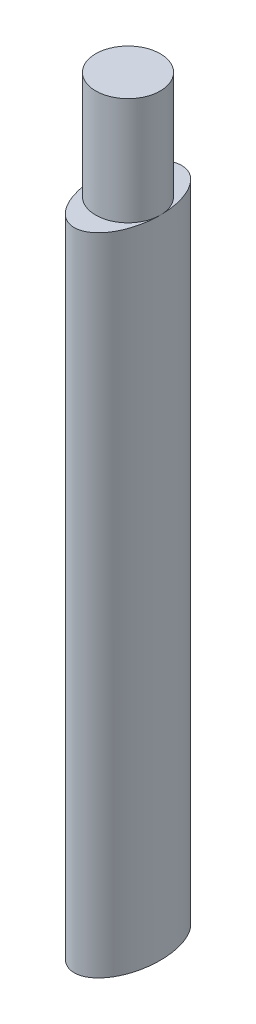
ISO-10303-21;
HEADER;
FILE_DESCRIPTION(('STEP AP214'),'2;1');
FILE_NAME('part.step','',(''),(''),'','','');
FILE_SCHEMA(('AUTOMOTIVE_DESIGN { 1 0 10303 214 1 1 1 1 }'));
ENDSEC;
DATA;
#1=APPLICATION_CONTEXT('core data for automotive mechanical design processes');
#2=APPLICATION_PROTOCOL_DEFINITION('international standard','automotive_design',2000,#1);
#3=PRODUCT_CONTEXT('',#1,'mechanical');
#4=PRODUCT('Part','Part','',(#3));
#5=PRODUCT_RELATED_PRODUCT_CATEGORY('part','',(#4));
#6=PRODUCT_DEFINITION_FORMATION('','',#4);
#7=PRODUCT_DEFINITION_CONTEXT('part definition',#1,'design');
#8=PRODUCT_DEFINITION('design','',#6,#7);
#9=PRODUCT_DEFINITION_SHAPE('','',#8);
#10=(LENGTH_UNIT() NAMED_UNIT(*) SI_UNIT(.MILLI.,.METRE.));
#11=(NAMED_UNIT(*) PLANE_ANGLE_UNIT() SI_UNIT($,.RADIAN.));
#12=(NAMED_UNIT(*) SI_UNIT($,.STERADIAN.) SOLID_ANGLE_UNIT());
#13=UNCERTAINTY_MEASURE_WITH_UNIT(LENGTH_MEASURE(1.E-05),#10,'distance_accuracy_value','');
#14=(GEOMETRIC_REPRESENTATION_CONTEXT(3) GLOBAL_UNCERTAINTY_ASSIGNED_CONTEXT((#13)) GLOBAL_UNIT_ASSIGNED_CONTEXT((#10,
#11,#12)) REPRESENTATION_CONTEXT('',''));
#15=CARTESIAN_POINT('',(0.,0.,0.));
#16=DIRECTION('',(0.,0.,1.));
#17=DIRECTION('',(1.,0.,0.));
#18=AXIS2_PLACEMENT_3D('',#15,#16,#17);
#19=CARTESIAN_POINT('',(0.,300.,0.));
#20=DIRECTION('',(0.,1.,0.));
#21=DIRECTION('',(0.,0.,1.));
#22=AXIS2_PLACEMENT_3D('',#19,#20,#21);
#23=PLANE('',#22);
#24=CARTESIAN_POINT('',(0.,300.,0.));
#25=DIRECTION('',(0.,1.,0.));
#26=DIRECTION('',(0.,0.,1.));
#27=AXIS2_PLACEMENT_3D('',#24,#25,#26);
#28=CIRCLE('',#27,15.);
#29=CARTESIAN_POINT('',(15.,300.,0.));
#30=VERTEX_POINT('',#29);
#31=CARTESIAN_POINT('',(-15.,300.,0.));
#32=VERTEX_POINT('',#31);
#33=EDGE_CURVE('E62',#30,#32,#28,.T.);
#34=ORIENTED_EDGE('',*,*,#33,.F.);
#35=CARTESIAN_POINT('',(0.,300.,0.));
#36=DIRECTION('',(0.,1.,0.));
#37=DIRECTION('',(0.,0.,-1.));
#38=AXIS2_PLACEMENT_3D('',#35,#36,#37);
#39=ELLIPSE('',#38,25.,15.);
#40=EDGE_CURVE('E73',#30,#32,#39,.T.);
#41=ORIENTED_EDGE('',*,*,#40,.T.);
#42=EDGE_LOOP('',(#34,#41));
#43=FACE_BOUND('',#42,.T.);
#44=ADVANCED_FACE('F51',(#43),#23,.T.);
#45=DIRECTION('',(0.,-1.,0.));
#46=VECTOR('',#45,1.);
#47=SURFACE_OF_LINEAR_EXTRUSION('',#39,#46);
#48=EDGE_CURVE('E60',#32,#30,#39,.T.);
#49=ORIENTED_EDGE('',*,*,#48,.F.);
#50=ORIENTED_EDGE('',*,*,#40,.F.);
#51=EDGE_LOOP('',(#49,#50));
#52=FACE_BOUND('',#51,.T.);
#53=CARTESIAN_POINT('',(0.,0.,0.));
#54=DIRECTION('',(0.,1.,0.));
#55=DIRECTION('',(0.,0.,-1.));
#56=AXIS2_PLACEMENT_3D('',#53,#54,#55);
#57=ELLIPSE('',#56,25.,15.);
#58=CARTESIAN_POINT('',(0.,0.,-25.));
#59=VERTEX_POINT('',#58);
#60=EDGE_CURVE('E56',#59,#59,#57,.T.);
#61=ORIENTED_EDGE('',*,*,#60,.T.);
#62=EDGE_LOOP('',(#61));
#63=FACE_BOUND('',#62,.T.);
#64=ADVANCED_FACE('F53',(#52,#63),#47,.F.);
#65=EDGE_CURVE('E13',#32,#30,#28,.T.);
#66=ORIENTED_EDGE('',*,*,#65,.F.);
#67=ORIENTED_EDGE('',*,*,#48,.T.);
#68=EDGE_LOOP('',(#66,#67));
#69=FACE_BOUND('',#68,.T.);
#70=ADVANCED_FACE('F70',(#69),#23,.T.);
#71=CARTESIAN_POINT('',(0.,0.,0.));
#72=DIRECTION('',(0.,1.,0.));
#73=DIRECTION('',(0.,0.,1.));
#74=AXIS2_PLACEMENT_3D('',#71,#72,#73);
#75=PLANE('',#74);
#76=ORIENTED_EDGE('',*,*,#60,.F.);
#77=EDGE_LOOP('',(#76));
#78=FACE_BOUND('',#77,.T.);
#79=ADVANCED_FACE('F82',(#78),#75,.F.);
#80=CARTESIAN_POINT('',(0.,350.,0.));
#81=DIRECTION('',(0.,-1.,0.));
#82=DIRECTION('',(0.,0.,-1.));
#83=AXIS2_PLACEMENT_3D('',#80,#81,#82);
#84=CYLINDRICAL_SURFACE('',#83,15.);
#85=CARTESIAN_POINT('',(0.,350.,0.));
#86=DIRECTION('',(0.,1.,0.));
#87=DIRECTION('',(0.,0.,1.));
#88=AXIS2_PLACEMENT_3D('',#85,#86,#87);
#89=CIRCLE('',#88,15.);
#90=CARTESIAN_POINT('',(0.,350.,15.));
#91=VERTEX_POINT('',#90);
#92=EDGE_CURVE('E78',#91,#91,#89,.T.);
#93=ORIENTED_EDGE('',*,*,#92,.F.);
#94=EDGE_LOOP('',(#93));
#95=FACE_BOUND('',#94,.T.);
#96=ORIENTED_EDGE('',*,*,#33,.T.);
#97=ORIENTED_EDGE('',*,*,#65,.T.);
#98=EDGE_LOOP('',(#96,#97));
#99=FACE_BOUND('',#98,.T.);
#100=ADVANCED_FACE('F79',(#95,#99),#84,.T.);
#101=CARTESIAN_POINT('',(0.,350.,0.));
#102=DIRECTION('',(0.,1.,0.));
#103=DIRECTION('',(0.,0.,1.));
#104=AXIS2_PLACEMENT_3D('',#101,#102,#103);
#105=PLANE('',#104);
#106=ORIENTED_EDGE('',*,*,#92,.T.);
#107=EDGE_LOOP('',(#106));
#108=FACE_BOUND('',#107,.T.);
#109=ADVANCED_FACE('F81',(#108),#105,.T.);
#110=CLOSED_SHELL('',(#44,#64,#70,#79,#100,#109));
#111=MANIFOLD_SOLID_BREP('B2',#110);
#112=ADVANCED_BREP_SHAPE_REPRESENTATION('',(#18,#111),#14);
#113=SHAPE_DEFINITION_REPRESENTATION(#9,#112);
ENDSEC;
END-ISO-10303-21;
